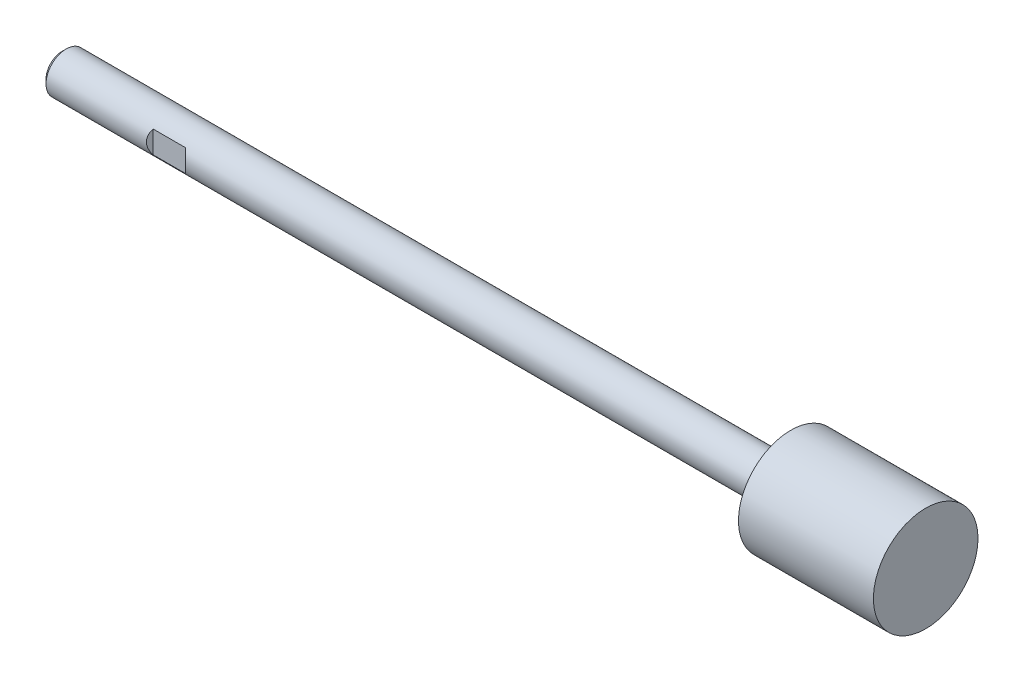
ISO-10303-21;
HEADER;
FILE_DESCRIPTION(('STEP AP214'),'2;1');
FILE_NAME('part.step','',(''),(''),'','','');
FILE_SCHEMA(('AUTOMOTIVE_DESIGN { 1 0 10303 214 1 1 1 1 }'));
ENDSEC;
DATA;
#1=APPLICATION_CONTEXT('core data for automotive mechanical design processes');
#2=APPLICATION_PROTOCOL_DEFINITION('international standard','automotive_design',2000,#1);
#3=PRODUCT_CONTEXT('',#1,'mechanical');
#4=PRODUCT('Part','Part','',(#3));
#5=PRODUCT_RELATED_PRODUCT_CATEGORY('part','',(#4));
#6=PRODUCT_DEFINITION_FORMATION('','',#4);
#7=PRODUCT_DEFINITION_CONTEXT('part definition',#1,'design');
#8=PRODUCT_DEFINITION('design','',#6,#7);
#9=PRODUCT_DEFINITION_SHAPE('','',#8);
#10=(LENGTH_UNIT() NAMED_UNIT(*) SI_UNIT(.MILLI.,.METRE.));
#11=(NAMED_UNIT(*) PLANE_ANGLE_UNIT() SI_UNIT($,.RADIAN.));
#12=(NAMED_UNIT(*) SI_UNIT($,.STERADIAN.) SOLID_ANGLE_UNIT());
#13=UNCERTAINTY_MEASURE_WITH_UNIT(LENGTH_MEASURE(1.E-05),#10,'distance_accuracy_value','');
#14=(GEOMETRIC_REPRESENTATION_CONTEXT(3) GLOBAL_UNCERTAINTY_ASSIGNED_CONTEXT((#13)) GLOBAL_UNIT_ASSIGNED_CONTEXT((#10,
#11,#12)) REPRESENTATION_CONTEXT('',''));
#15=CARTESIAN_POINT('',(0.,0.,0.));
#16=DIRECTION('',(0.,0.,1.));
#17=DIRECTION('',(1.,0.,0.));
#18=AXIS2_PLACEMENT_3D('',#15,#16,#17);
#19=CARTESIAN_POINT('',(128.,0.,0.));
#20=DIRECTION('',(1.,0.,0.));
#21=DIRECTION('',(0.,0.,-1.));
#22=AXIS2_PLACEMENT_3D('',#19,#20,#21);
#23=CYLINDRICAL_SURFACE('',#22,3.);
#24=CARTESIAN_POINT('',(16.0000000023952,-1.65831239878853,-2.49999999760485));
#25=CARTESIAN_POINT('',(15.8444361935459,-1.42379113365501,-2.65556380645408));
#26=CARTESIAN_POINT('',(15.7141450639294,-1.15266930135842,-2.78585493607065));
#27=CARTESIAN_POINT('',(15.5412922907834,-0.579381510358978,-2.95870770921655));
#28=CARTESIAN_POINT('',(15.5,-0.301232165318897,-3.));
#29=CARTESIAN_POINT('',(15.5,0.301232165317736,-3.));
#30=CARTESIAN_POINT('',(15.5412922907831,0.579381510356781,-2.95870770921686));
#31=CARTESIAN_POINT('',(15.7141450639277,1.15266930135414,-2.78585493607229));
#32=CARTESIAN_POINT('',(15.8444361935433,1.42379113364987,-2.65556380645673));
#33=CARTESIAN_POINT('',(16.0000000023914,1.65831239878289,-2.49999999760859));
#34=B_SPLINE_CURVE_WITH_KNOTS('',3,(#24,#25,#26,#27,#28,#29,#30,#31,#32,#33),.UNSPECIFIED.,.F.,
.F.,(4,2,2,2,4),(2.55590710868831,2.84874988113905,3.14159265358979,3.43443542603941,
3.72727819848902),.UNSPECIFIED.);
#35=CARTESIAN_POINT('',(16.,-1.6583123951777,-2.5));
#36=VERTEX_POINT('',#35);
#37=CARTESIAN_POINT('',(16.,1.6583123951777,-2.5));
#38=VERTEX_POINT('',#37);
#39=EDGE_CURVE('E62',#36,#38,#34,.T.);
#40=ORIENTED_EDGE('',*,*,#39,.F.);
#41=DIRECTION('',(-1.,0.,0.));
#42=VECTOR('',#41,1.);
#43=CARTESIAN_POINT('',(20.8,-1.6583123951777,-2.5));
#44=LINE('',#43,#42);
#45=CARTESIAN_POINT('',(20.8,-1.65831239517771,-2.5));
#46=VERTEX_POINT('',#45);
#47=EDGE_CURVE('E72',#46,#36,#44,.T.);
#48=ORIENTED_EDGE('',*,*,#47,.F.);
#49=CARTESIAN_POINT('',(20.799999997612,1.65831239877774,-2.499999997612));
#50=CARTESIAN_POINT('',(20.9555638064591,1.42379113364519,-2.65556380645914));
#51=CARTESIAN_POINT('',(21.0858549360738,1.15266930135023,-2.78585493607379));
#52=CARTESIAN_POINT('',(21.2587077092171,0.579381510354778,-2.95870770921714));
#53=CARTESIAN_POINT('',(21.3,0.301232165316656,-3.));
#54=CARTESIAN_POINT('',(21.3,-0.301232165319117,-3.));
#55=CARTESIAN_POINT('',(21.2587077092165,-0.579381510359437,-2.95870770921649));
#56=CARTESIAN_POINT('',(21.0858549360703,-1.15266930135932,-2.7858549360703));
#57=CARTESIAN_POINT('',(20.9555638064535,-1.42379113365608,-2.65556380645353));
#58=CARTESIAN_POINT('',(20.7999999976041,-1.65831239878971,-2.49999999760407));
#59=B_SPLINE_CURVE_WITH_KNOTS('',3,(#49,#50,#51,#52,#53,#54,#55,#56,#57,#58),.UNSPECIFIED.,.F.,
.F.,(4,2,2,2,4),(5.69749976228242,5.990342534731,6.28318530717959,6.57602807963056,
6.86887085208154),.UNSPECIFIED.);
#60=CARTESIAN_POINT('',(20.8,1.65831239517771,-2.5));
#61=VERTEX_POINT('',#60);
#62=EDGE_CURVE('E78',#61,#46,#59,.T.);
#63=ORIENTED_EDGE('',*,*,#62,.F.);
#64=DIRECTION('',(1.,0.,0.));
#65=VECTOR('',#64,1.);
#66=CARTESIAN_POINT('',(16.,1.6583123951777,-2.5));
#67=LINE('',#66,#65);
#68=EDGE_CURVE('E77',#38,#61,#67,.T.);
#69=ORIENTED_EDGE('',*,*,#68,.F.);
#70=EDGE_LOOP('',(#40,#48,#63,#69));
#71=FACE_BOUND('',#70,.T.);
#72=CARTESIAN_POINT('',(108.,0.,0.));
#73=DIRECTION('',(1.,0.,0.));
#74=DIRECTION('',(0.,0.,-1.));
#75=AXIS2_PLACEMENT_3D('',#72,#73,#74);
#76=CIRCLE('',#75,3.);
#77=CARTESIAN_POINT('',(108.,0.,-3.));
#78=VERTEX_POINT('',#77);
#79=EDGE_CURVE('E200',#78,#78,#76,.T.);
#80=ORIENTED_EDGE('',*,*,#79,.F.);
#81=EDGE_LOOP('',(#80));
#82=FACE_BOUND('',#81,.T.);
#83=CARTESIAN_POINT('',(0.613499999999988,0.,0.));
#84=DIRECTION('',(1.,0.,0.));
#85=DIRECTION('',(0.,0.,-1.));
#86=AXIS2_PLACEMENT_3D('',#83,#84,#85);
#87=CIRCLE('',#86,3.);
#88=CARTESIAN_POINT('',(0.613499999999988,0.,-3.));
#89=VERTEX_POINT('',#88);
#90=EDGE_CURVE('E194',#89,#89,#87,.T.);
#91=ORIENTED_EDGE('',*,*,#90,.T.);
#92=EDGE_LOOP('',(#91));
#93=FACE_BOUND('',#92,.T.);
#94=CARTESIAN_POINT('',(20.7999999976094,-1.65831239878171,2.49999999760937));
#95=CARTESIAN_POINT('',(20.9555638064573,-1.4237911336488,2.65556380645728));
#96=CARTESIAN_POINT('',(21.0858549360726,-1.15266930135325,2.78585493607264));
#97=CARTESIAN_POINT('',(21.2587077092169,-0.579381510356323,2.95870770921693));
#98=CARTESIAN_POINT('',(21.3,-0.301232165317417,3.));
#99=CARTESIAN_POINT('',(21.3,0.301232165316255,3.));
#100=CARTESIAN_POINT('',(21.2587077092172,0.579381510354126,2.95870770921724));
#101=CARTESIAN_POINT('',(21.0858549360743,1.15266930134896,2.78585493607428));
#102=CARTESIAN_POINT('',(20.9555638064599,1.42379113364367,2.65556380645992));
#103=CARTESIAN_POINT('',(20.7999999976131,1.65831239877607,2.49999999761311));
#104=B_SPLINE_CURVE_WITH_KNOTS('',3,(#94,#95,#96,#97,#98,#99,#100,#101,#102,#103),.UNSPECIFIED.,
.F.,.F.,(4,2,2,2,4),(5.69749976228083,5.99034253473021,6.28318530717959,6.57602807962784,
6.86887085207609),.UNSPECIFIED.);
#105=CARTESIAN_POINT('',(20.8,-1.6583123951777,2.5));
#106=VERTEX_POINT('',#105);
#107=CARTESIAN_POINT('',(20.8,1.6583123951777,2.5));
#108=VERTEX_POINT('',#107);
#109=EDGE_CURVE('E126',#106,#108,#104,.T.);
#110=ORIENTED_EDGE('',*,*,#109,.F.);
#111=DIRECTION('',(1.,0.,0.));
#112=VECTOR('',#111,1.);
#113=CARTESIAN_POINT('',(16.,-1.6583123951777,2.5));
#114=LINE('',#113,#112);
#115=CARTESIAN_POINT('',(16.,-1.65831239517771,2.5));
#116=VERTEX_POINT('',#115);
#117=EDGE_CURVE('E119',#116,#106,#114,.T.);
#118=ORIENTED_EDGE('',*,*,#117,.F.);
#119=CARTESIAN_POINT('',(16.0000000023997,1.65831239879534,2.49999999760033));
#120=CARTESIAN_POINT('',(15.8444361935491,1.42379113366121,2.65556380645089));
#121=CARTESIAN_POINT('',(15.7141450639313,1.1526693013636,2.78585493606866));
#122=CARTESIAN_POINT('',(15.5412922907838,0.579381510361632,2.95870770921618));
#123=CARTESIAN_POINT('',(15.5,0.301232165320377,3.));
#124=CARTESIAN_POINT('',(15.5,-0.301232165319225,3.));
#125=CARTESIAN_POINT('',(15.5412922907835,-0.57938151035945,2.95870770921649));
#126=CARTESIAN_POINT('',(15.7141450639297,-1.15266930135934,2.7858549360703));
#127=CARTESIAN_POINT('',(15.8444361935465,-1.42379113365611,2.65556380645351));
#128=CARTESIAN_POINT('',(16.000000002396,-1.65831239878974,2.49999999760405));
#129=B_SPLINE_CURVE_WITH_KNOTS('',3,(#119,#120,#121,#122,#123,#124,#125,#126,#127,#128),
.UNSPECIFIED.,.F.,.F.,(4,2,2,2,4),(2.55590710868559,2.84874988113769,3.14159265358979,
3.43443542604078,3.72727819849176),.UNSPECIFIED.);
#130=CARTESIAN_POINT('',(16.,1.65831239517771,2.5));
#131=VERTEX_POINT('',#130);
#132=EDGE_CURVE('E125',#131,#116,#129,.T.);
#133=ORIENTED_EDGE('',*,*,#132,.F.);
#134=DIRECTION('',(-1.,0.,0.));
#135=VECTOR('',#134,1.);
#136=CARTESIAN_POINT('',(20.8,1.6583123951777,2.5));
#137=LINE('',#136,#135);
#138=EDGE_CURVE('E129',#108,#131,#137,.T.);
#139=ORIENTED_EDGE('',*,*,#138,.F.);
#140=EDGE_LOOP('',(#110,#118,#133,#139));
#141=FACE_BOUND('',#140,.T.);
#142=ADVANCED_FACE('F17',(#71,#82,#93,#141),#23,.T.);
#143=CARTESIAN_POINT('',(0.,0.,0.));
#144=DIRECTION('',(1.,0.,0.));
#145=DIRECTION('',(0.,0.,-1.));
#146=AXIS2_PLACEMENT_3D('',#143,#144,#145);
#147=PLANE('',#146);
#148=CARTESIAN_POINT('',(0.,0.,0.));
#149=DIRECTION('',(1.,0.,0.));
#150=DIRECTION('',(0.,0.,-1.));
#151=AXIS2_PLACEMENT_3D('',#148,#149,#150);
#152=CIRCLE('',#151,2.3865);
#153=CARTESIAN_POINT('',(0.,0.,-2.3865));
#154=VERTEX_POINT('',#153);
#155=EDGE_CURVE('E133',#154,#154,#152,.T.);
#156=ORIENTED_EDGE('',*,*,#155,.F.);
#157=EDGE_LOOP('',(#156));
#158=FACE_BOUND('',#157,.T.);
#159=ADVANCED_FACE('F101',(#158),#147,.F.);
#160=CARTESIAN_POINT('',(0.,0.,0.));
#161=DIRECTION('',(1.,0.,0.));
#162=DIRECTION('',(0.,0.,-1.));
#163=AXIS2_PLACEMENT_3D('',#160,#161,#162);
#164=CONICAL_SURFACE('',#163,2.3865,0.785398163397457);
#165=ORIENTED_EDGE('',*,*,#90,.F.);
#166=EDGE_LOOP('',(#165));
#167=FACE_BOUND('',#166,.T.);
#168=ORIENTED_EDGE('',*,*,#155,.T.);
#169=EDGE_LOOP('',(#168));
#170=FACE_BOUND('',#169,.T.);
#171=ADVANCED_FACE('F210',(#167,#170),#164,.T.);
#172=CARTESIAN_POINT('',(108.,3.,0.));
#173=DIRECTION('',(1.,0.,0.));
#174=DIRECTION('',(0.,0.,-1.));
#175=AXIS2_PLACEMENT_3D('',#172,#173,#174);
#176=PLANE('',#175);
#177=CARTESIAN_POINT('',(108.,0.,0.));
#178=DIRECTION('',(1.,0.,0.));
#179=DIRECTION('',(0.,0.,-1.));
#180=AXIS2_PLACEMENT_3D('',#177,#178,#179);
#181=CIRCLE('',#180,7.75);
#182=CARTESIAN_POINT('',(108.,0.,-7.75));
#183=VERTEX_POINT('',#182);
#184=EDGE_CURVE('E134',#183,#183,#181,.T.);
#185=ORIENTED_EDGE('',*,*,#184,.F.);
#186=EDGE_LOOP('',(#185));
#187=FACE_BOUND('',#186,.T.);
#188=ORIENTED_EDGE('',*,*,#79,.T.);
#189=EDGE_LOOP('',(#188));
#190=FACE_BOUND('',#189,.T.);
#191=ADVANCED_FACE('F204',(#187,#190),#176,.F.);
#192=CARTESIAN_POINT('',(128.,0.,0.));
#193=DIRECTION('',(1.,0.,0.));
#194=DIRECTION('',(0.,0.,-1.));
#195=AXIS2_PLACEMENT_3D('',#192,#193,#194);
#196=CYLINDRICAL_SURFACE('',#195,7.75);
#197=CARTESIAN_POINT('',(128.,0.,0.));
#198=DIRECTION('',(1.,0.,0.));
#199=DIRECTION('',(0.,0.,-1.));
#200=AXIS2_PLACEMENT_3D('',#197,#198,#199);
#201=CIRCLE('',#200,7.75);
#202=CARTESIAN_POINT('',(128.,0.,-7.75));
#203=VERTEX_POINT('',#202);
#204=EDGE_CURVE('E145',#203,#203,#201,.T.);
#205=ORIENTED_EDGE('',*,*,#204,.F.);
#206=EDGE_LOOP('',(#205));
#207=FACE_BOUND('',#206,.T.);
#208=ORIENTED_EDGE('',*,*,#184,.T.);
#209=EDGE_LOOP('',(#208));
#210=FACE_BOUND('',#209,.T.);
#211=ADVANCED_FACE('F209',(#207,#210),#196,.T.);
#212=CARTESIAN_POINT('',(128.,7.75,0.));
#213=DIRECTION('',(-1.,0.,0.));
#214=DIRECTION('',(0.,0.,1.));
#215=AXIS2_PLACEMENT_3D('',#212,#213,#214);
#216=PLANE('',#215);
#217=ORIENTED_EDGE('',*,*,#204,.T.);
#218=EDGE_LOOP('',(#217));
#219=FACE_BOUND('',#218,.T.);
#220=ADVANCED_FACE('F165',(#219),#216,.F.);
#221=CARTESIAN_POINT('',(20.8,2.5,-2.5));
#222=DIRECTION('',(-0.707106781186548,0.,-0.707106781186548));
#223=DIRECTION('',(-0.707106781186548,0.,0.707106781186548));
#224=AXIS2_PLACEMENT_3D('',#221,#222,#223);
#225=PLANE('',#224);
#226=ORIENTED_EDGE('',*,*,#62,.T.);
#227=DIRECTION('',(0.,-1.,0.));
#228=VECTOR('',#227,1.);
#229=CARTESIAN_POINT('',(20.8,1.65831239517771,-2.5));
#230=LINE('',#229,#228);
#231=EDGE_CURVE('E70',#61,#46,#230,.T.);
#232=ORIENTED_EDGE('',*,*,#231,.F.);
#233=EDGE_LOOP('',(#226,#232));
#234=FACE_BOUND('',#233,.T.);
#235=ADVANCED_FACE('F152',(#234),#225,.T.);
#236=CARTESIAN_POINT('',(16.,2.5,-2.5));
#237=DIRECTION('',(0.,0.,-1.));
#238=DIRECTION('',(-1.,0.,0.));
#239=AXIS2_PLACEMENT_3D('',#236,#237,#238);
#240=PLANE('',#239);
#241=ORIENTED_EDGE('',*,*,#68,.T.);
#242=ORIENTED_EDGE('',*,*,#231,.T.);
#243=ORIENTED_EDGE('',*,*,#47,.T.);
#244=DIRECTION('',(0.,-1.,0.));
#245=VECTOR('',#244,1.);
#246=CARTESIAN_POINT('',(16.,1.6583123951777,-2.5));
#247=LINE('',#246,#245);
#248=EDGE_CURVE('E56',#38,#36,#247,.T.);
#249=ORIENTED_EDGE('',*,*,#248,.F.);
#250=EDGE_LOOP('',(#241,#242,#243,#249));
#251=FACE_BOUND('',#250,.T.);
#252=ADVANCED_FACE('F79',(#251),#240,.T.);
#253=CARTESIAN_POINT('',(14.4,2.5,-4.1));
#254=DIRECTION('',(0.707106781186548,0.,-0.707106781186548));
#255=DIRECTION('',(-0.707106781186548,0.,-0.707106781186548));
#256=AXIS2_PLACEMENT_3D('',#253,#254,#255);
#257=PLANE('',#256);
#258=ORIENTED_EDGE('',*,*,#39,.T.);
#259=ORIENTED_EDGE('',*,*,#248,.T.);
#260=EDGE_LOOP('',(#258,#259));
#261=FACE_BOUND('',#260,.T.);
#262=ADVANCED_FACE('F61',(#261),#257,.T.);
#263=CARTESIAN_POINT('',(30.3,2.5,12.));
#264=DIRECTION('',(-0.707106781186548,0.,0.707106781186548));
#265=DIRECTION('',(0.707106781186548,0.,0.707106781186548));
#266=AXIS2_PLACEMENT_3D('',#263,#264,#265);
#267=PLANE('',#266);
#268=ORIENTED_EDGE('',*,*,#109,.T.);
#269=DIRECTION('',(0.,-1.,0.));
#270=VECTOR('',#269,1.);
#271=CARTESIAN_POINT('',(20.8,1.6583123951777,2.5));
#272=LINE('',#271,#270);
#273=EDGE_CURVE('E29',#108,#106,#272,.T.);
#274=ORIENTED_EDGE('',*,*,#273,.T.);
#275=EDGE_LOOP('',(#268,#274));
#276=FACE_BOUND('',#275,.T.);
#277=ADVANCED_FACE('F167',(#276),#267,.T.);
#278=CARTESIAN_POINT('',(20.8,2.5,2.5));
#279=DIRECTION('',(0.,0.,1.));
#280=DIRECTION('',(1.,0.,0.));
#281=AXIS2_PLACEMENT_3D('',#278,#279,#280);
#282=PLANE('',#281);
#283=ORIENTED_EDGE('',*,*,#117,.T.);
#284=ORIENTED_EDGE('',*,*,#273,.F.);
#285=ORIENTED_EDGE('',*,*,#138,.T.);
#286=DIRECTION('',(0.,-1.,0.));
#287=VECTOR('',#286,1.);
#288=CARTESIAN_POINT('',(16.,1.65831239517771,2.5));
#289=LINE('',#288,#287);
#290=EDGE_CURVE('E11',#131,#116,#289,.T.);
#291=ORIENTED_EDGE('',*,*,#290,.T.);
#292=EDGE_LOOP('',(#283,#284,#285,#291));
#293=FACE_BOUND('',#292,.T.);
#294=ADVANCED_FACE('F131',(#293),#282,.T.);
#295=CARTESIAN_POINT('',(16.,2.5,2.5));
#296=DIRECTION('',(0.707106781186548,0.,0.707106781186548));
#297=DIRECTION('',(0.707106781186548,0.,-0.707106781186548));
#298=AXIS2_PLACEMENT_3D('',#295,#296,#297);
#299=PLANE('',#298);
#300=ORIENTED_EDGE('',*,*,#132,.T.);
#301=ORIENTED_EDGE('',*,*,#290,.F.);
#302=EDGE_LOOP('',(#300,#301));
#303=FACE_BOUND('',#302,.T.);
#304=ADVANCED_FACE('F19',(#303),#299,.T.);
#305=CLOSED_SHELL('',(#142,#159,#171,#191,#211,#220,#235,#252,#262,#277,#294,#304));
#306=MANIFOLD_SOLID_BREP('B1',#305);
#307=ADVANCED_BREP_SHAPE_REPRESENTATION('',(#18,#306),#14);
#308=SHAPE_DEFINITION_REPRESENTATION(#9,#307);
ENDSEC;
END-ISO-10303-21;
